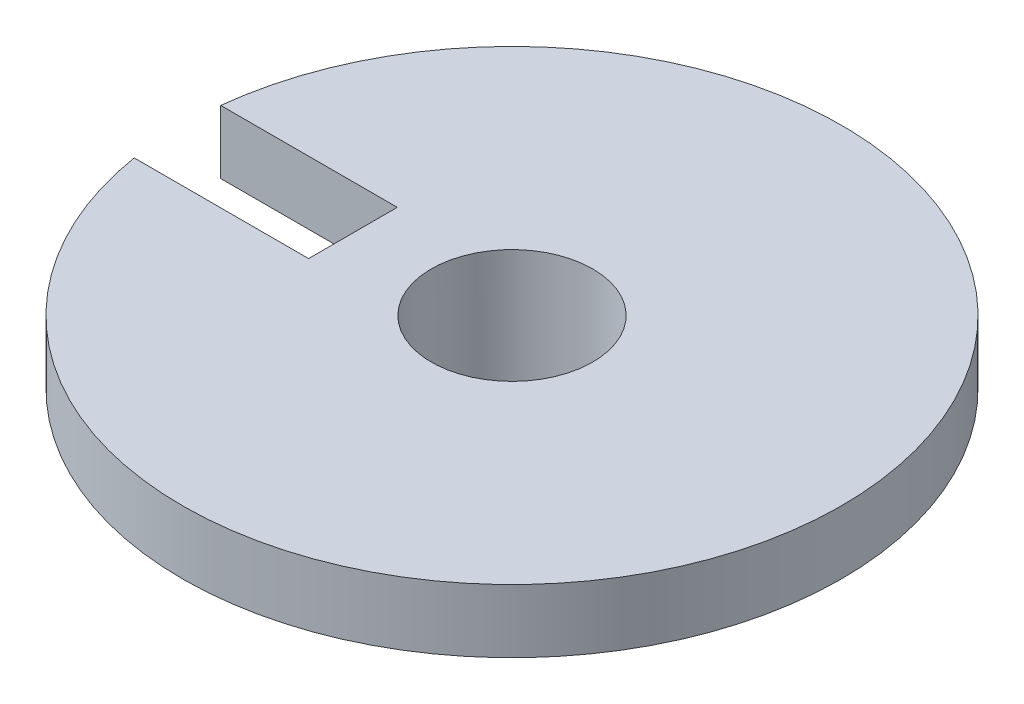
ISO-10303-21;
HEADER;
FILE_DESCRIPTION(('STEP AP214'),'2;1');
FILE_NAME('part.step','',(''),(''),'','','');
FILE_SCHEMA(('AUTOMOTIVE_DESIGN { 1 0 10303 214 1 1 1 1 }'));
ENDSEC;
DATA;
#1=APPLICATION_CONTEXT('core data for automotive mechanical design processes');
#2=APPLICATION_PROTOCOL_DEFINITION('international standard','automotive_design',2000,#1);
#3=PRODUCT_CONTEXT('',#1,'mechanical');
#4=PRODUCT('Part','Part','',(#3));
#5=PRODUCT_RELATED_PRODUCT_CATEGORY('part','',(#4));
#6=PRODUCT_DEFINITION_FORMATION('','',#4);
#7=PRODUCT_DEFINITION_CONTEXT('part definition',#1,'design');
#8=PRODUCT_DEFINITION('design','',#6,#7);
#9=PRODUCT_DEFINITION_SHAPE('','',#8);
#10=(LENGTH_UNIT() NAMED_UNIT(*) SI_UNIT(.MILLI.,.METRE.));
#11=(NAMED_UNIT(*) PLANE_ANGLE_UNIT() SI_UNIT($,.RADIAN.));
#12=(NAMED_UNIT(*) SI_UNIT($,.STERADIAN.) SOLID_ANGLE_UNIT());
#13=UNCERTAINTY_MEASURE_WITH_UNIT(LENGTH_MEASURE(1.E-05),#10,'distance_accuracy_value','');
#14=(GEOMETRIC_REPRESENTATION_CONTEXT(3) GLOBAL_UNCERTAINTY_ASSIGNED_CONTEXT((#13)) GLOBAL_UNIT_ASSIGNED_CONTEXT((#10,
#11,#12)) REPRESENTATION_CONTEXT('',''));
#15=CARTESIAN_POINT('',(0.,0.,0.));
#16=DIRECTION('',(0.,0.,1.));
#17=DIRECTION('',(1.,0.,0.));
#18=AXIS2_PLACEMENT_3D('',#15,#16,#17);
#19=CARTESIAN_POINT('',(0.,0.,0.));
#20=DIRECTION('',(0.,1.,0.));
#21=DIRECTION('',(0.,0.,1.));
#22=AXIS2_PLACEMENT_3D('',#19,#20,#21);
#23=PLANE('',#22);
#24=CARTESIAN_POINT('',(0.,0.,0.));
#25=DIRECTION('',(0.,1.,0.));
#26=DIRECTION('',(0.,0.,1.));
#27=AXIS2_PLACEMENT_3D('',#24,#25,#26);
#28=CIRCLE('',#27,5.685);
#29=CARTESIAN_POINT('',(0.,0.,5.685));
#30=VERTEX_POINT('',#29);
#31=EDGE_CURVE('E110',#30,#30,#28,.T.);
#32=ORIENTED_EDGE('',*,*,#31,.F.);
#33=EDGE_LOOP('',(#32));
#34=FACE_BOUND('',#33,.T.);
#35=CARTESIAN_POINT('',(0.,0.,0.));
#36=DIRECTION('',(0.,1.,0.));
#37=DIRECTION('',(0.,0.,1.));
#38=AXIS2_PLACEMENT_3D('',#35,#36,#37);
#39=CIRCLE('',#38,3.185);
#40=CARTESIAN_POINT('',(0.,0.,3.185));
#41=VERTEX_POINT('',#40);
#42=EDGE_CURVE('E106',#41,#41,#39,.T.);
#43=ORIENTED_EDGE('',*,*,#42,.T.);
#44=EDGE_LOOP('',(#43));
#45=FACE_BOUND('',#44,.T.);
#46=ADVANCED_FACE('F33',(#34,#45),#23,.F.);
#47=CARTESIAN_POINT('',(0.,4.46,0.));
#48=DIRECTION('',(0.,-1.,0.));
#49=DIRECTION('',(0.,0.,-1.));
#50=AXIS2_PLACEMENT_3D('',#47,#48,#49);
#51=CYLINDRICAL_SURFACE('',#50,5.685);
#52=CARTESIAN_POINT('',(0.,4.46,0.));
#53=DIRECTION('',(0.,1.,0.));
#54=DIRECTION('',(0.,0.,1.));
#55=AXIS2_PLACEMENT_3D('',#52,#53,#54);
#56=CIRCLE('',#55,5.685);
#57=CARTESIAN_POINT('',(0.,4.46,5.685));
#58=VERTEX_POINT('',#57);
#59=EDGE_CURVE('E111',#58,#58,#56,.T.);
#60=ORIENTED_EDGE('',*,*,#59,.F.);
#61=EDGE_LOOP('',(#60));
#62=FACE_BOUND('',#61,.T.);
#63=ORIENTED_EDGE('',*,*,#31,.T.);
#64=EDGE_LOOP('',(#63));
#65=FACE_BOUND('',#64,.T.);
#66=ADVANCED_FACE('F35',(#62,#65),#51,.T.);
#67=CARTESIAN_POINT('',(0.,4.46,0.));
#68=DIRECTION('',(0.,-1.,0.));
#69=DIRECTION('',(0.,0.,-1.));
#70=AXIS2_PLACEMENT_3D('',#67,#68,#69);
#71=CYLINDRICAL_SURFACE('',#70,3.185);
#72=ORIENTED_EDGE('',*,*,#42,.F.);
#73=EDGE_LOOP('',(#72));
#74=FACE_BOUND('',#73,.T.);
#75=CARTESIAN_POINT('',(0.,6.96,0.));
#76=DIRECTION('',(0.,-1.,0.));
#77=DIRECTION('',(0.,0.,-1.));
#78=AXIS2_PLACEMENT_3D('',#75,#76,#77);
#79=CIRCLE('',#78,3.185);
#80=CARTESIAN_POINT('',(0.,6.96,-3.185));
#81=VERTEX_POINT('',#80);
#82=EDGE_CURVE('E99',#81,#81,#79,.T.);
#83=ORIENTED_EDGE('',*,*,#82,.F.);
#84=EDGE_LOOP('',(#83));
#85=FACE_BOUND('',#84,.T.);
#86=ADVANCED_FACE('F138',(#74,#85),#71,.F.);
#87=CARTESIAN_POINT('',(0.,4.46,0.));
#88=DIRECTION('',(0.,1.,0.));
#89=DIRECTION('',(0.,0.,1.));
#90=AXIS2_PLACEMENT_3D('',#87,#88,#89);
#91=PLANE('',#90);
#92=CARTESIAN_POINT('',(0.,4.46,0.));
#93=DIRECTION('',(0.,1.,0.));
#94=DIRECTION('',(0.,0.,1.));
#95=AXIS2_PLACEMENT_3D('',#92,#93,#94);
#96=CIRCLE('',#95,13.);
#97=CARTESIAN_POINT('',(-12.8344634874386,4.46,2.06798138038153));
#98=VERTEX_POINT('',#97);
#99=CARTESIAN_POINT('',(-12.9208870698983,4.46,-1.43201861961847));
#100=VERTEX_POINT('',#99);
#101=EDGE_CURVE('E102',#98,#100,#96,.T.);
#102=ORIENTED_EDGE('',*,*,#101,.F.);
#103=DIRECTION('',(-1.,0.,0.));
#104=VECTOR('',#103,1.);
#105=CARTESIAN_POINT('',(-14.4713232814184,4.46,2.06798138038153));
#106=LINE('',#105,#104);
#107=CARTESIAN_POINT('',(-5.95622417341066,4.46,2.06798138038153));
#108=VERTEX_POINT('',#107);
#109=EDGE_CURVE('E80',#108,#98,#106,.T.);
#110=ORIENTED_EDGE('',*,*,#109,.F.);
#111=DIRECTION('',(0.,0.,1.));
#112=VECTOR('',#111,1.);
#113=CARTESIAN_POINT('',(-5.95622417341066,4.46,2.06798138038153));
#114=LINE('',#113,#112);
#115=CARTESIAN_POINT('',(-5.95622417341066,4.46,-1.43201861961847));
#116=VERTEX_POINT('',#115);
#117=EDGE_CURVE('E75',#116,#108,#114,.T.);
#118=ORIENTED_EDGE('',*,*,#117,.F.);
#119=DIRECTION('',(1.,0.,0.));
#120=VECTOR('',#119,1.);
#121=CARTESIAN_POINT('',(-14.4713232814184,4.46,-1.43201861961847));
#122=LINE('',#121,#120);
#123=EDGE_CURVE('E83',#100,#116,#122,.T.);
#124=ORIENTED_EDGE('',*,*,#123,.F.);
#125=EDGE_LOOP('',(#102,#110,#118,#124));
#126=FACE_BOUND('',#125,.T.);
#127=ORIENTED_EDGE('',*,*,#59,.T.);
#128=EDGE_LOOP('',(#127));
#129=FACE_BOUND('',#128,.T.);
#130=ADVANCED_FACE('F91',(#126,#129),#91,.F.);
#131=CARTESIAN_POINT('',(0.,6.96,0.));
#132=DIRECTION('',(0.,-1.,0.));
#133=DIRECTION('',(0.,0.,-1.));
#134=AXIS2_PLACEMENT_3D('',#131,#132,#133);
#135=CYLINDRICAL_SURFACE('',#134,13.);
#136=CARTESIAN_POINT('',(0.,6.96,0.));
#137=DIRECTION('',(0.,1.,0.));
#138=DIRECTION('',(0.,0.,1.));
#139=AXIS2_PLACEMENT_3D('',#136,#137,#138);
#140=CIRCLE('',#139,13.);
#141=CARTESIAN_POINT('',(-12.8344634874386,6.96,2.06798138038153));
#142=VERTEX_POINT('',#141);
#143=CARTESIAN_POINT('',(-12.9208870698983,6.96,-1.43201861961847));
#144=VERTEX_POINT('',#143);
#145=EDGE_CURVE('E103',#142,#144,#140,.T.);
#146=ORIENTED_EDGE('',*,*,#145,.F.);
#147=DIRECTION('',(0.,-1.,0.));
#148=VECTOR('',#147,1.);
#149=CARTESIAN_POINT('',(-12.8344634874386,6.96,2.06798138038153));
#150=LINE('',#149,#148);
#151=EDGE_CURVE('E55',#142,#98,#150,.T.);
#152=ORIENTED_EDGE('',*,*,#151,.T.);
#153=ORIENTED_EDGE('',*,*,#101,.T.);
#154=DIRECTION('',(0.,-1.,0.));
#155=VECTOR('',#154,1.);
#156=CARTESIAN_POINT('',(-12.9208870698983,6.96,-1.43201861961847));
#157=LINE('',#156,#155);
#158=EDGE_CURVE('E86',#100,#144,#157,.F.);
#159=ORIENTED_EDGE('',*,*,#158,.T.);
#160=EDGE_LOOP('',(#146,#152,#153,#159));
#161=FACE_BOUND('',#160,.T.);
#162=ADVANCED_FACE('F120',(#161),#135,.T.);
#163=CARTESIAN_POINT('',(0.,6.96,0.));
#164=DIRECTION('',(0.,1.,0.));
#165=DIRECTION('',(0.,0.,1.));
#166=AXIS2_PLACEMENT_3D('',#163,#164,#165);
#167=PLANE('',#166);
#168=DIRECTION('',(1.,0.,0.));
#169=VECTOR('',#168,1.);
#170=CARTESIAN_POINT('',(0.,6.96,2.06798138038153));
#171=LINE('',#170,#169);
#172=CARTESIAN_POINT('',(-5.95622417341066,6.96,2.06798138038153));
#173=VERTEX_POINT('',#172);
#174=EDGE_CURVE('E11',#142,#173,#171,.T.);
#175=ORIENTED_EDGE('',*,*,#174,.F.);
#176=ORIENTED_EDGE('',*,*,#145,.T.);
#177=DIRECTION('',(-1.,0.,0.));
#178=VECTOR('',#177,1.);
#179=CARTESIAN_POINT('',(0.,6.96,-1.43201861961847));
#180=LINE('',#179,#178);
#181=CARTESIAN_POINT('',(-5.95622417341066,6.96,-1.43201861961847));
#182=VERTEX_POINT('',#181);
#183=EDGE_CURVE('E114',#182,#144,#180,.T.);
#184=ORIENTED_EDGE('',*,*,#183,.F.);
#185=DIRECTION('',(0.,0.,-1.));
#186=VECTOR('',#185,1.);
#187=CARTESIAN_POINT('',(-5.95622417341066,6.96,0.));
#188=LINE('',#187,#186);
#189=EDGE_CURVE('E41',#173,#182,#188,.T.);
#190=ORIENTED_EDGE('',*,*,#189,.F.);
#191=EDGE_LOOP('',(#175,#176,#184,#190));
#192=FACE_BOUND('',#191,.T.);
#193=ORIENTED_EDGE('',*,*,#82,.T.);
#194=EDGE_LOOP('',(#193));
#195=FACE_BOUND('',#194,.T.);
#196=ADVANCED_FACE('F121',(#192,#195),#167,.T.);
#197=CARTESIAN_POINT('',(-14.4713232814184,14.46,2.06798138038153));
#198=DIRECTION('',(0.,0.,1.));
#199=DIRECTION('',(1.,0.,0.));
#200=AXIS2_PLACEMENT_3D('',#197,#198,#199);
#201=PLANE('',#200);
#202=ORIENTED_EDGE('',*,*,#174,.T.);
#203=DIRECTION('',(0.,-1.,0.));
#204=VECTOR('',#203,1.);
#205=CARTESIAN_POINT('',(-5.95622417341066,14.46,2.06798138038153));
#206=LINE('',#205,#204);
#207=EDGE_CURVE('E79',#173,#108,#206,.T.);
#208=ORIENTED_EDGE('',*,*,#207,.T.);
#209=ORIENTED_EDGE('',*,*,#109,.T.);
#210=ORIENTED_EDGE('',*,*,#151,.F.);
#211=EDGE_LOOP('',(#202,#208,#209,#210));
#212=FACE_BOUND('',#211,.T.);
#213=ADVANCED_FACE('F123',(#212),#201,.F.);
#214=CARTESIAN_POINT('',(-14.4713232814184,14.46,-1.43201861961847));
#215=DIRECTION('',(0.,0.,-1.));
#216=DIRECTION('',(-1.,0.,0.));
#217=AXIS2_PLACEMENT_3D('',#214,#215,#216);
#218=PLANE('',#217);
#219=ORIENTED_EDGE('',*,*,#123,.T.);
#220=DIRECTION('',(0.,-1.,0.));
#221=VECTOR('',#220,1.);
#222=CARTESIAN_POINT('',(-5.95622417341066,14.46,-1.43201861961847));
#223=LINE('',#222,#221);
#224=EDGE_CURVE('E48',#182,#116,#223,.T.);
#225=ORIENTED_EDGE('',*,*,#224,.F.);
#226=ORIENTED_EDGE('',*,*,#183,.T.);
#227=ORIENTED_EDGE('',*,*,#158,.F.);
#228=EDGE_LOOP('',(#219,#225,#226,#227));
#229=FACE_BOUND('',#228,.T.);
#230=ADVANCED_FACE('F84',(#229),#218,.F.);
#231=CARTESIAN_POINT('',(-5.95622417341066,14.46,2.06798138038153));
#232=DIRECTION('',(1.,0.,0.));
#233=DIRECTION('',(0.,0.,-1.));
#234=AXIS2_PLACEMENT_3D('',#231,#232,#233);
#235=PLANE('',#234);
#236=ORIENTED_EDGE('',*,*,#189,.T.);
#237=ORIENTED_EDGE('',*,*,#224,.T.);
#238=ORIENTED_EDGE('',*,*,#117,.T.);
#239=ORIENTED_EDGE('',*,*,#207,.F.);
#240=EDGE_LOOP('',(#236,#237,#238,#239));
#241=FACE_BOUND('',#240,.T.);
#242=ADVANCED_FACE('F72',(#241),#235,.F.);
#243=CLOSED_SHELL('',(#46,#66,#86,#130,#162,#196,#213,#230,#242));
#244=MANIFOLD_SOLID_BREP('B2',#243);
#245=ADVANCED_BREP_SHAPE_REPRESENTATION('',(#18,#244),#14);
#246=SHAPE_DEFINITION_REPRESENTATION(#9,#245);
ENDSEC;
END-ISO-10303-21;
